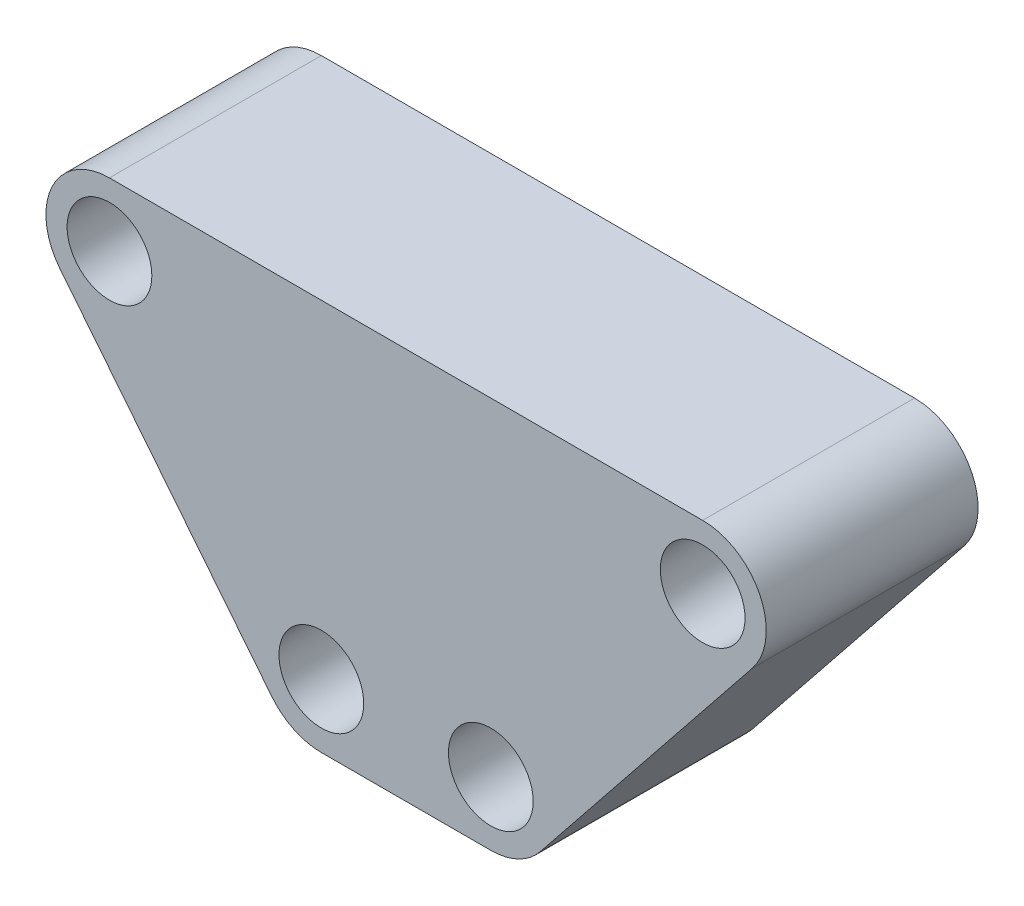
ISO-10303-21;
HEADER;
FILE_DESCRIPTION(('STEP AP214'),'2;1');
FILE_NAME('part.step','',(''),(''),'','','');
FILE_SCHEMA(('AUTOMOTIVE_DESIGN { 1 0 10303 214 1 1 1 1 }'));
ENDSEC;
DATA;
#1=APPLICATION_CONTEXT('core data for automotive mechanical design processes');
#2=APPLICATION_PROTOCOL_DEFINITION('international standard','automotive_design',2000,#1);
#3=PRODUCT_CONTEXT('',#1,'mechanical');
#4=PRODUCT('Part','Part','',(#3));
#5=PRODUCT_RELATED_PRODUCT_CATEGORY('part','',(#4));
#6=PRODUCT_DEFINITION_FORMATION('','',#4);
#7=PRODUCT_DEFINITION_CONTEXT('part definition',#1,'design');
#8=PRODUCT_DEFINITION('design','',#6,#7);
#9=PRODUCT_DEFINITION_SHAPE('','',#8);
#10=(LENGTH_UNIT() NAMED_UNIT(*) SI_UNIT(.MILLI.,.METRE.));
#11=(NAMED_UNIT(*) PLANE_ANGLE_UNIT() SI_UNIT($,.RADIAN.));
#12=(NAMED_UNIT(*) SI_UNIT($,.STERADIAN.) SOLID_ANGLE_UNIT());
#13=UNCERTAINTY_MEASURE_WITH_UNIT(LENGTH_MEASURE(1.E-05),#10,'distance_accuracy_value','');
#14=(GEOMETRIC_REPRESENTATION_CONTEXT(3) GLOBAL_UNCERTAINTY_ASSIGNED_CONTEXT((#13)) GLOBAL_UNIT_ASSIGNED_CONTEXT((#10,
#11,#12)) REPRESENTATION_CONTEXT('',''));
#15=CARTESIAN_POINT('',(0.,0.,0.));
#16=DIRECTION('',(0.,0.,1.));
#17=DIRECTION('',(1.,0.,0.));
#18=AXIS2_PLACEMENT_3D('',#15,#16,#17);
#19=CARTESIAN_POINT('',(45.,31.224989991992,25.));
#20=DIRECTION('',(0.,0.,-1.));
#21=DIRECTION('',(-1.,0.,0.));
#22=AXIS2_PLACEMENT_3D('',#19,#20,#21);
#23=CYLINDRICAL_SURFACE('',#22,7.50000000000001);
#24=CARTESIAN_POINT('',(45.,31.224989991992,0.));
#25=DIRECTION('',(0.,0.,1.));
#26=DIRECTION('',(1.,0.,0.));
#27=AXIS2_PLACEMENT_3D('',#24,#25,#26);
#28=CIRCLE('',#27,7.50000000000001);
#29=CARTESIAN_POINT('',(50.8546856234985,26.537489991992,0.));
#30=VERTEX_POINT('',#29);
#31=CARTESIAN_POINT('',(45.,38.724989991992,0.));
#32=VERTEX_POINT('',#31);
#33=EDGE_CURVE('E132',#30,#32,#28,.T.);
#34=ORIENTED_EDGE('',*,*,#33,.T.);
#35=DIRECTION('',(0.,0.,-1.));
#36=VECTOR('',#35,1.);
#37=CARTESIAN_POINT('',(45.,38.724989991992,25.));
#38=LINE('',#37,#36);
#39=CARTESIAN_POINT('',(45.,38.724989991992,25.));
#40=VERTEX_POINT('',#39);
#41=EDGE_CURVE('E11',#40,#32,#38,.T.);
#42=ORIENTED_EDGE('',*,*,#41,.F.);
#43=CARTESIAN_POINT('',(45.,31.224989991992,25.));
#44=DIRECTION('',(0.,0.,1.));
#45=DIRECTION('',(1.,0.,0.));
#46=AXIS2_PLACEMENT_3D('',#43,#44,#45);
#47=CIRCLE('',#46,7.50000000000001);
#48=CARTESIAN_POINT('',(50.8546856234985,26.537489991992,25.));
#49=VERTEX_POINT('',#48);
#50=EDGE_CURVE('E147',#49,#40,#47,.T.);
#51=ORIENTED_EDGE('',*,*,#50,.F.);
#52=DIRECTION('',(0.,0.,-1.));
#53=VECTOR('',#52,1.);
#54=CARTESIAN_POINT('',(50.8546856234985,26.537489991992,25.));
#55=LINE('',#54,#53);
#56=EDGE_CURVE('E128',#49,#30,#55,.T.);
#57=ORIENTED_EDGE('',*,*,#56,.T.);
#58=EDGE_LOOP('',(#34,#42,#51,#57));
#59=FACE_BOUND('',#58,.T.);
#60=ADVANCED_FACE('F36',(#59),#23,.T.);
#61=CARTESIAN_POINT('',(-25.,38.724989991992,25.));
#62=DIRECTION('',(0.,-1.,0.));
#63=DIRECTION('',(1.,0.,0.));
#64=AXIS2_PLACEMENT_3D('',#61,#62,#63);
#65=PLANE('',#64);
#66=DIRECTION('',(-1.,0.,0.));
#67=VECTOR('',#66,1.);
#68=CARTESIAN_POINT('',(-25.,38.724989991992,0.));
#69=LINE('',#68,#67);
#70=CARTESIAN_POINT('',(-25.,38.724989991992,0.));
#71=VERTEX_POINT('',#70);
#72=EDGE_CURVE('E135',#32,#71,#69,.T.);
#73=ORIENTED_EDGE('',*,*,#72,.T.);
#74=DIRECTION('',(0.,0.,-1.));
#75=VECTOR('',#74,1.);
#76=CARTESIAN_POINT('',(-25.,38.724989991992,25.));
#77=LINE('',#76,#75);
#78=CARTESIAN_POINT('',(-25.,38.724989991992,25.));
#79=VERTEX_POINT('',#78);
#80=EDGE_CURVE('E44',#79,#71,#77,.T.);
#81=ORIENTED_EDGE('',*,*,#80,.F.);
#82=DIRECTION('',(-1.,0.,0.));
#83=VECTOR('',#82,1.);
#84=CARTESIAN_POINT('',(-25.,38.724989991992,25.));
#85=LINE('',#84,#83);
#86=EDGE_CURVE('E95',#40,#79,#85,.T.);
#87=ORIENTED_EDGE('',*,*,#86,.F.);
#88=ORIENTED_EDGE('',*,*,#41,.T.);
#89=EDGE_LOOP('',(#73,#81,#87,#88));
#90=FACE_BOUND('',#89,.T.);
#91=ADVANCED_FACE('F238',(#90),#65,.F.);
#92=CARTESIAN_POINT('',(-25.,31.224989991992,25.));
#93=DIRECTION('',(0.,0.,-1.));
#94=DIRECTION('',(-1.,0.,0.));
#95=AXIS2_PLACEMENT_3D('',#92,#93,#94);
#96=CYLINDRICAL_SURFACE('',#95,7.5);
#97=CARTESIAN_POINT('',(-25.,31.224989991992,0.));
#98=DIRECTION('',(0.,0.,1.));
#99=DIRECTION('',(1.,0.,0.));
#100=AXIS2_PLACEMENT_3D('',#97,#98,#99);
#101=CIRCLE('',#100,7.5);
#102=CARTESIAN_POINT('',(-30.8546856234985,26.537489991992,0.));
#103=VERTEX_POINT('',#102);
#104=EDGE_CURVE('E138',#71,#103,#101,.T.);
#105=ORIENTED_EDGE('',*,*,#104,.T.);
#106=DIRECTION('',(0.,0.,-1.));
#107=VECTOR('',#106,1.);
#108=CARTESIAN_POINT('',(-30.8546856234985,26.537489991992,25.));
#109=LINE('',#108,#107);
#110=CARTESIAN_POINT('',(-30.8546856234985,26.537489991992,25.));
#111=VERTEX_POINT('',#110);
#112=EDGE_CURVE('E154',#111,#103,#109,.T.);
#113=ORIENTED_EDGE('',*,*,#112,.F.);
#114=CARTESIAN_POINT('',(-25.,31.224989991992,25.));
#115=DIRECTION('',(0.,0.,1.));
#116=DIRECTION('',(1.,0.,0.));
#117=AXIS2_PLACEMENT_3D('',#114,#115,#116);
#118=CIRCLE('',#117,7.5);
#119=EDGE_CURVE('E162',#79,#111,#118,.T.);
#120=ORIENTED_EDGE('',*,*,#119,.F.);
#121=ORIENTED_EDGE('',*,*,#80,.T.);
#122=EDGE_LOOP('',(#105,#113,#120,#121));
#123=FACE_BOUND('',#122,.T.);
#124=ADVANCED_FACE('F160',(#123),#96,.T.);
#125=CARTESIAN_POINT('',(-30.8546856234985,26.537489991992,25.));
#126=DIRECTION('',(0.7806247497998,0.625,0.));
#127=DIRECTION('',(-0.625,0.7806247497998,0.));
#128=AXIS2_PLACEMENT_3D('',#125,#126,#127);
#129=PLANE('',#128);
#130=DIRECTION('',(0.625,-0.7806247497998,0.));
#131=VECTOR('',#130,1.);
#132=CARTESIAN_POINT('',(-30.8546856234985,26.537489991992,0.));
#133=LINE('',#132,#131);
#134=CARTESIAN_POINT('',(-5.8546856234985,-4.6875,0.));
#135=VERTEX_POINT('',#134);
#136=EDGE_CURVE('E140',#103,#135,#133,.T.);
#137=ORIENTED_EDGE('',*,*,#136,.T.);
#138=DIRECTION('',(0.,0.,-1.));
#139=VECTOR('',#138,1.);
#140=CARTESIAN_POINT('',(-5.8546856234985,-4.6875,25.));
#141=LINE('',#140,#139);
#142=CARTESIAN_POINT('',(-5.8546856234985,-4.6875,25.));
#143=VERTEX_POINT('',#142);
#144=EDGE_CURVE('E151',#143,#135,#141,.T.);
#145=ORIENTED_EDGE('',*,*,#144,.F.);
#146=DIRECTION('',(0.625,-0.7806247497998,0.));
#147=VECTOR('',#146,1.);
#148=CARTESIAN_POINT('',(-30.8546856234985,26.537489991992,25.));
#149=LINE('',#148,#147);
#150=EDGE_CURVE('E174',#111,#143,#149,.T.);
#151=ORIENTED_EDGE('',*,*,#150,.F.);
#152=ORIENTED_EDGE('',*,*,#112,.T.);
#153=EDGE_LOOP('',(#137,#145,#151,#152));
#154=FACE_BOUND('',#153,.T.);
#155=ADVANCED_FACE('F170',(#154),#129,.F.);
#156=CARTESIAN_POINT('',(0.,0.,25.));
#157=DIRECTION('',(0.,0.,-1.));
#158=DIRECTION('',(-1.,0.,0.));
#159=AXIS2_PLACEMENT_3D('',#156,#157,#158);
#160=CYLINDRICAL_SURFACE('',#159,7.5);
#161=CARTESIAN_POINT('',(0.,0.,0.));
#162=DIRECTION('',(0.,0.,1.));
#163=DIRECTION('',(1.,0.,0.));
#164=AXIS2_PLACEMENT_3D('',#161,#162,#163);
#165=CIRCLE('',#164,7.5);
#166=CARTESIAN_POINT('',(0.,-7.5,0.));
#167=VERTEX_POINT('',#166);
#168=EDGE_CURVE('E142',#135,#167,#165,.T.);
#169=ORIENTED_EDGE('',*,*,#168,.T.);
#170=DIRECTION('',(0.,0.,-1.));
#171=VECTOR('',#170,1.);
#172=CARTESIAN_POINT('',(0.,-7.5,25.));
#173=LINE('',#172,#171);
#174=CARTESIAN_POINT('',(0.,-7.5,25.));
#175=VERTEX_POINT('',#174);
#176=EDGE_CURVE('E123',#175,#167,#173,.T.);
#177=ORIENTED_EDGE('',*,*,#176,.F.);
#178=CARTESIAN_POINT('',(0.,0.,25.));
#179=DIRECTION('',(0.,0.,1.));
#180=DIRECTION('',(1.,0.,0.));
#181=AXIS2_PLACEMENT_3D('',#178,#179,#180);
#182=CIRCLE('',#181,7.5);
#183=EDGE_CURVE('E114',#143,#175,#182,.T.);
#184=ORIENTED_EDGE('',*,*,#183,.F.);
#185=ORIENTED_EDGE('',*,*,#144,.T.);
#186=EDGE_LOOP('',(#169,#177,#184,#185));
#187=FACE_BOUND('',#186,.T.);
#188=ADVANCED_FACE('F173',(#187),#160,.T.);
#189=CARTESIAN_POINT('',(0.,-7.5,25.));
#190=DIRECTION('',(0.,1.,0.));
#191=DIRECTION('',(0.,0.,1.));
#192=AXIS2_PLACEMENT_3D('',#189,#190,#191);
#193=PLANE('',#192);
#194=DIRECTION('',(1.,0.,0.));
#195=VECTOR('',#194,1.);
#196=CARTESIAN_POINT('',(0.,-7.5,0.));
#197=LINE('',#196,#195);
#198=CARTESIAN_POINT('',(20.,-7.5,0.));
#199=VERTEX_POINT('',#198);
#200=EDGE_CURVE('E122',#167,#199,#197,.T.);
#201=ORIENTED_EDGE('',*,*,#200,.T.);
#202=DIRECTION('',(0.,0.,-1.));
#203=VECTOR('',#202,1.);
#204=CARTESIAN_POINT('',(20.,-7.5,25.));
#205=LINE('',#204,#203);
#206=CARTESIAN_POINT('',(20.,-7.5,25.));
#207=VERTEX_POINT('',#206);
#208=EDGE_CURVE('E119',#207,#199,#205,.T.);
#209=ORIENTED_EDGE('',*,*,#208,.F.);
#210=DIRECTION('',(1.,0.,0.));
#211=VECTOR('',#210,1.);
#212=CARTESIAN_POINT('',(0.,-7.5,25.));
#213=LINE('',#212,#211);
#214=EDGE_CURVE('E108',#175,#207,#213,.T.);
#215=ORIENTED_EDGE('',*,*,#214,.F.);
#216=ORIENTED_EDGE('',*,*,#176,.T.);
#217=EDGE_LOOP('',(#201,#209,#215,#216));
#218=FACE_BOUND('',#217,.T.);
#219=ADVANCED_FACE('F120',(#218),#193,.F.);
#220=CARTESIAN_POINT('',(20.,0.,25.));
#221=DIRECTION('',(0.,0.,-1.));
#222=DIRECTION('',(-1.,0.,0.));
#223=AXIS2_PLACEMENT_3D('',#220,#221,#222);
#224=CYLINDRICAL_SURFACE('',#223,7.5);
#225=CARTESIAN_POINT('',(20.,0.,0.));
#226=DIRECTION('',(0.,0.,1.));
#227=DIRECTION('',(1.,0.,0.));
#228=AXIS2_PLACEMENT_3D('',#225,#226,#227);
#229=CIRCLE('',#228,7.5);
#230=CARTESIAN_POINT('',(25.8546856234985,-4.6875,0.));
#231=VERTEX_POINT('',#230);
#232=EDGE_CURVE('E81',#199,#231,#229,.T.);
#233=ORIENTED_EDGE('',*,*,#232,.T.);
#234=DIRECTION('',(0.,0.,-1.));
#235=VECTOR('',#234,1.);
#236=CARTESIAN_POINT('',(25.8546856234985,-4.6875,25.));
#237=LINE('',#236,#235);
#238=CARTESIAN_POINT('',(25.8546856234985,-4.6875,25.));
#239=VERTEX_POINT('',#238);
#240=EDGE_CURVE('E124',#239,#231,#237,.T.);
#241=ORIENTED_EDGE('',*,*,#240,.F.);
#242=CARTESIAN_POINT('',(20.,0.,25.));
#243=DIRECTION('',(0.,0.,1.));
#244=DIRECTION('',(1.,0.,0.));
#245=AXIS2_PLACEMENT_3D('',#242,#243,#244);
#246=CIRCLE('',#245,7.5);
#247=EDGE_CURVE('E112',#207,#239,#246,.T.);
#248=ORIENTED_EDGE('',*,*,#247,.F.);
#249=ORIENTED_EDGE('',*,*,#208,.T.);
#250=EDGE_LOOP('',(#233,#241,#248,#249));
#251=FACE_BOUND('',#250,.T.);
#252=ADVANCED_FACE('F126',(#251),#224,.T.);
#253=CARTESIAN_POINT('',(50.8546856234985,26.537489991992,25.));
#254=DIRECTION('',(-0.7806247497998,0.625,0.));
#255=DIRECTION('',(-0.625,-0.7806247497998,0.));
#256=AXIS2_PLACEMENT_3D('',#253,#254,#255);
#257=PLANE('',#256);
#258=DIRECTION('',(0.625,0.7806247497998,0.));
#259=VECTOR('',#258,1.);
#260=CARTESIAN_POINT('',(50.8546856234985,26.537489991992,0.));
#261=LINE('',#260,#259);
#262=EDGE_CURVE('E87',#231,#30,#261,.T.);
#263=ORIENTED_EDGE('',*,*,#262,.T.);
#264=ORIENTED_EDGE('',*,*,#56,.F.);
#265=DIRECTION('',(0.625,0.7806247497998,0.));
#266=VECTOR('',#265,1.);
#267=CARTESIAN_POINT('',(50.8546856234985,26.537489991992,25.));
#268=LINE('',#267,#266);
#269=EDGE_CURVE('E52',#239,#49,#268,.T.);
#270=ORIENTED_EDGE('',*,*,#269,.F.);
#271=ORIENTED_EDGE('',*,*,#240,.T.);
#272=EDGE_LOOP('',(#263,#264,#270,#271));
#273=FACE_BOUND('',#272,.T.);
#274=ADVANCED_FACE('F215',(#273),#257,.F.);
#275=CARTESIAN_POINT('',(45.,31.224989991992,25.));
#276=DIRECTION('',(0.,0.,1.));
#277=DIRECTION('',(1.,0.,0.));
#278=AXIS2_PLACEMENT_3D('',#275,#276,#277);
#279=PLANE('',#278);
#280=CARTESIAN_POINT('',(-25.,31.224989991992,25.));
#281=DIRECTION('',(0.,0.,1.));
#282=DIRECTION('',(1.,0.,0.));
#283=AXIS2_PLACEMENT_3D('',#280,#281,#282);
#284=CIRCLE('',#283,5.);
#285=CARTESIAN_POINT('',(-20.,31.224989991992,25.));
#286=VERTEX_POINT('',#285);
#287=EDGE_CURVE('E198',#286,#286,#284,.T.);
#288=ORIENTED_EDGE('',*,*,#287,.F.);
#289=EDGE_LOOP('',(#288));
#290=FACE_BOUND('',#289,.T.);
#291=CARTESIAN_POINT('',(0.,0.,25.));
#292=DIRECTION('',(0.,0.,1.));
#293=DIRECTION('',(1.,0.,0.));
#294=AXIS2_PLACEMENT_3D('',#291,#292,#293);
#295=CIRCLE('',#294,5.);
#296=CARTESIAN_POINT('',(5.,0.,25.));
#297=VERTEX_POINT('',#296);
#298=EDGE_CURVE('E192',#297,#297,#295,.T.);
#299=ORIENTED_EDGE('',*,*,#298,.F.);
#300=EDGE_LOOP('',(#299));
#301=FACE_BOUND('',#300,.T.);
#302=CARTESIAN_POINT('',(20.,0.,25.));
#303=DIRECTION('',(0.,0.,1.));
#304=DIRECTION('',(1.,0.,0.));
#305=AXIS2_PLACEMENT_3D('',#302,#303,#304);
#306=CIRCLE('',#305,5.);
#307=CARTESIAN_POINT('',(25.,0.,25.));
#308=VERTEX_POINT('',#307);
#309=EDGE_CURVE('E186',#308,#308,#306,.T.);
#310=ORIENTED_EDGE('',*,*,#309,.F.);
#311=EDGE_LOOP('',(#310));
#312=FACE_BOUND('',#311,.T.);
#313=CARTESIAN_POINT('',(45.,31.224989991992,25.));
#314=DIRECTION('',(0.,0.,1.));
#315=DIRECTION('',(1.,0.,0.));
#316=AXIS2_PLACEMENT_3D('',#313,#314,#315);
#317=CIRCLE('',#316,5.);
#318=CARTESIAN_POINT('',(50.,31.224989991992,25.));
#319=VERTEX_POINT('',#318);
#320=EDGE_CURVE('E180',#319,#319,#317,.T.);
#321=ORIENTED_EDGE('',*,*,#320,.F.);
#322=EDGE_LOOP('',(#321));
#323=FACE_BOUND('',#322,.T.);
#324=ORIENTED_EDGE('',*,*,#50,.T.);
#325=ORIENTED_EDGE('',*,*,#86,.T.);
#326=ORIENTED_EDGE('',*,*,#119,.T.);
#327=ORIENTED_EDGE('',*,*,#150,.T.);
#328=ORIENTED_EDGE('',*,*,#183,.T.);
#329=ORIENTED_EDGE('',*,*,#214,.T.);
#330=ORIENTED_EDGE('',*,*,#247,.T.);
#331=ORIENTED_EDGE('',*,*,#269,.T.);
#332=EDGE_LOOP('',(#324,#325,#326,#327,#328,#329,#330,#331));
#333=FACE_BOUND('',#332,.T.);
#334=ADVANCED_FACE('F110',(#290,#301,#312,#323,#333),#279,.T.);
#335=CARTESIAN_POINT('',(45.,31.224989991992,0.));
#336=DIRECTION('',(0.,0.,1.));
#337=DIRECTION('',(1.,0.,0.));
#338=AXIS2_PLACEMENT_3D('',#335,#336,#337);
#339=PLANE('',#338);
#340=ORIENTED_EDGE('',*,*,#33,.F.);
#341=ORIENTED_EDGE('',*,*,#262,.F.);
#342=ORIENTED_EDGE('',*,*,#232,.F.);
#343=ORIENTED_EDGE('',*,*,#200,.F.);
#344=ORIENTED_EDGE('',*,*,#168,.F.);
#345=ORIENTED_EDGE('',*,*,#136,.F.);
#346=ORIENTED_EDGE('',*,*,#104,.F.);
#347=ORIENTED_EDGE('',*,*,#72,.F.);
#348=EDGE_LOOP('',(#340,#341,#342,#343,#344,#345,#346,#347));
#349=FACE_BOUND('',#348,.T.);
#350=ADVANCED_FACE('F166',(#349),#339,.F.);
#351=CARTESIAN_POINT('',(45.,31.224989991992,15.));
#352=DIRECTION('',(0.,0.,1.));
#353=DIRECTION('',(1.,0.,0.));
#354=AXIS2_PLACEMENT_3D('',#351,#352,#353);
#355=CYLINDRICAL_SURFACE('',#354,5.);
#356=CARTESIAN_POINT('',(45.,31.224989991992,15.));
#357=DIRECTION('',(0.,0.,1.));
#358=DIRECTION('',(1.,0.,0.));
#359=AXIS2_PLACEMENT_3D('',#356,#357,#358);
#360=CIRCLE('',#359,5.);
#361=CARTESIAN_POINT('',(50.,31.224989991992,15.));
#362=VERTEX_POINT('',#361);
#363=EDGE_CURVE('E183',#362,#362,#360,.T.);
#364=ORIENTED_EDGE('',*,*,#363,.F.);
#365=EDGE_LOOP('',(#364));
#366=FACE_BOUND('',#365,.T.);
#367=ORIENTED_EDGE('',*,*,#320,.T.);
#368=EDGE_LOOP('',(#367));
#369=FACE_BOUND('',#368,.T.);
#370=ADVANCED_FACE('F223',(#366,#369),#355,.F.);
#371=CARTESIAN_POINT('',(45.,31.224989991992,15.));
#372=DIRECTION('',(0.,0.,1.));
#373=DIRECTION('',(1.,0.,0.));
#374=AXIS2_PLACEMENT_3D('',#371,#372,#373);
#375=PLANE('',#374);
#376=ORIENTED_EDGE('',*,*,#363,.T.);
#377=EDGE_LOOP('',(#376));
#378=FACE_BOUND('',#377,.T.);
#379=ADVANCED_FACE('F225',(#378),#375,.T.);
#380=CARTESIAN_POINT('',(20.,0.,15.));
#381=DIRECTION('',(0.,0.,1.));
#382=DIRECTION('',(1.,0.,0.));
#383=AXIS2_PLACEMENT_3D('',#380,#381,#382);
#384=CYLINDRICAL_SURFACE('',#383,5.);
#385=CARTESIAN_POINT('',(20.,0.,15.));
#386=DIRECTION('',(0.,0.,1.));
#387=DIRECTION('',(1.,0.,0.));
#388=AXIS2_PLACEMENT_3D('',#385,#386,#387);
#389=CIRCLE('',#388,5.);
#390=CARTESIAN_POINT('',(25.,0.,15.));
#391=VERTEX_POINT('',#390);
#392=EDGE_CURVE('E189',#391,#391,#389,.T.);
#393=ORIENTED_EDGE('',*,*,#392,.F.);
#394=EDGE_LOOP('',(#393));
#395=FACE_BOUND('',#394,.T.);
#396=ORIENTED_EDGE('',*,*,#309,.T.);
#397=EDGE_LOOP('',(#396));
#398=FACE_BOUND('',#397,.T.);
#399=ADVANCED_FACE('F232',(#395,#398),#384,.F.);
#400=CARTESIAN_POINT('',(20.,0.,15.));
#401=DIRECTION('',(0.,0.,1.));
#402=DIRECTION('',(1.,0.,0.));
#403=AXIS2_PLACEMENT_3D('',#400,#401,#402);
#404=PLANE('',#403);
#405=ORIENTED_EDGE('',*,*,#392,.T.);
#406=EDGE_LOOP('',(#405));
#407=FACE_BOUND('',#406,.T.);
#408=ADVANCED_FACE('F314',(#407),#404,.T.);
#409=CARTESIAN_POINT('',(0.,0.,15.));
#410=DIRECTION('',(0.,0.,1.));
#411=DIRECTION('',(1.,0.,0.));
#412=AXIS2_PLACEMENT_3D('',#409,#410,#411);
#413=CYLINDRICAL_SURFACE('',#412,5.);
#414=CARTESIAN_POINT('',(0.,0.,15.));
#415=DIRECTION('',(0.,0.,1.));
#416=DIRECTION('',(1.,0.,0.));
#417=AXIS2_PLACEMENT_3D('',#414,#415,#416);
#418=CIRCLE('',#417,5.);
#419=CARTESIAN_POINT('',(5.,0.,15.));
#420=VERTEX_POINT('',#419);
#421=EDGE_CURVE('E195',#420,#420,#418,.T.);
#422=ORIENTED_EDGE('',*,*,#421,.F.);
#423=EDGE_LOOP('',(#422));
#424=FACE_BOUND('',#423,.T.);
#425=ORIENTED_EDGE('',*,*,#298,.T.);
#426=EDGE_LOOP('',(#425));
#427=FACE_BOUND('',#426,.T.);
#428=ADVANCED_FACE('F324',(#424,#427),#413,.F.);
#429=CARTESIAN_POINT('',(0.,0.,15.));
#430=DIRECTION('',(0.,0.,1.));
#431=DIRECTION('',(1.,0.,0.));
#432=AXIS2_PLACEMENT_3D('',#429,#430,#431);
#433=PLANE('',#432);
#434=ORIENTED_EDGE('',*,*,#421,.T.);
#435=EDGE_LOOP('',(#434));
#436=FACE_BOUND('',#435,.T.);
#437=ADVANCED_FACE('F209',(#436),#433,.T.);
#438=CARTESIAN_POINT('',(-25.,31.224989991992,15.));
#439=DIRECTION('',(0.,0.,1.));
#440=DIRECTION('',(1.,0.,0.));
#441=AXIS2_PLACEMENT_3D('',#438,#439,#440);
#442=CYLINDRICAL_SURFACE('',#441,5.);
#443=CARTESIAN_POINT('',(-25.,31.224989991992,15.));
#444=DIRECTION('',(0.,0.,1.));
#445=DIRECTION('',(1.,0.,0.));
#446=AXIS2_PLACEMENT_3D('',#443,#444,#445);
#447=CIRCLE('',#446,5.);
#448=CARTESIAN_POINT('',(-20.,31.224989991992,15.));
#449=VERTEX_POINT('',#448);
#450=EDGE_CURVE('E136',#449,#449,#447,.T.);
#451=ORIENTED_EDGE('',*,*,#450,.F.);
#452=EDGE_LOOP('',(#451));
#453=FACE_BOUND('',#452,.T.);
#454=ORIENTED_EDGE('',*,*,#287,.T.);
#455=EDGE_LOOP('',(#454));
#456=FACE_BOUND('',#455,.T.);
#457=ADVANCED_FACE('F206',(#453,#456),#442,.F.);
#458=CARTESIAN_POINT('',(-25.,31.224989991992,15.));
#459=DIRECTION('',(0.,0.,1.));
#460=DIRECTION('',(1.,0.,0.));
#461=AXIS2_PLACEMENT_3D('',#458,#459,#460);
#462=PLANE('',#461);
#463=ORIENTED_EDGE('',*,*,#450,.T.);
#464=EDGE_LOOP('',(#463));
#465=FACE_BOUND('',#464,.T.);
#466=ADVANCED_FACE('F204',(#465),#462,.T.);
#467=CLOSED_SHELL('',(#60,#91,#124,#155,#188,#219,#252,#274,#334,#350,#370,#379,#399,#408,#428,
#437,#457,#466));
#468=MANIFOLD_SOLID_BREP('B2',#467);
#469=ADVANCED_BREP_SHAPE_REPRESENTATION('',(#18,#468),#14);
#470=SHAPE_DEFINITION_REPRESENTATION(#9,#469);
ENDSEC;
END-ISO-10303-21;
